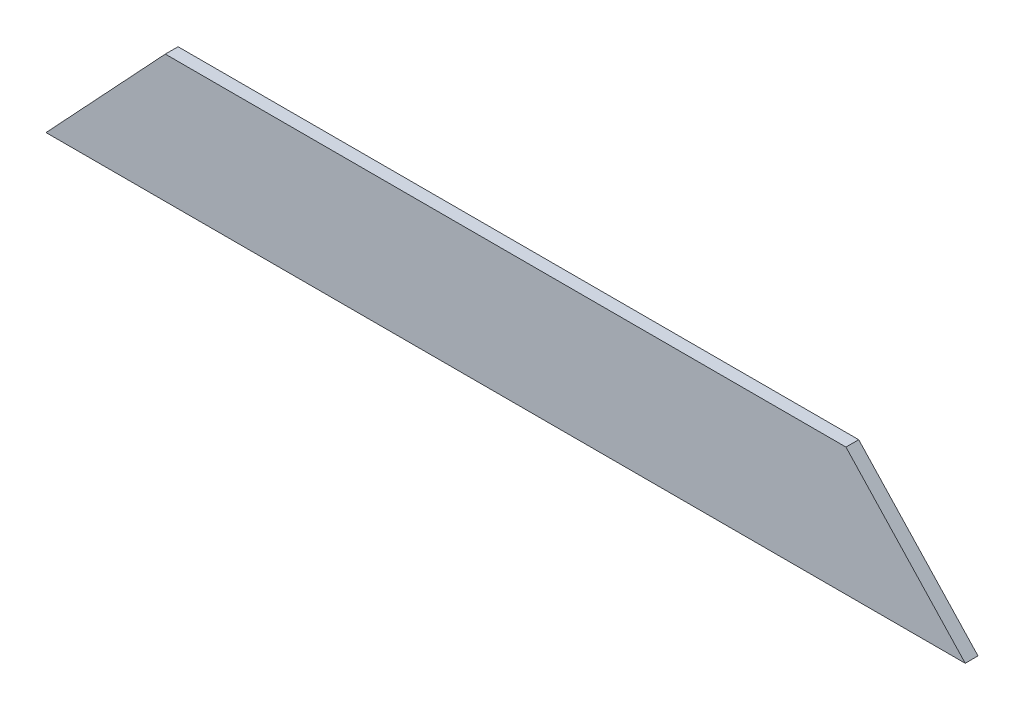
ISO-10303-21;
HEADER;
FILE_DESCRIPTION(('STEP AP214'),'2;1');
FILE_NAME('part.step','',(''),(''),'','','');
FILE_SCHEMA(('AUTOMOTIVE_DESIGN { 1 0 10303 214 1 1 1 1 }'));
ENDSEC;
DATA;
#1=APPLICATION_CONTEXT('core data for automotive mechanical design processes');
#2=APPLICATION_PROTOCOL_DEFINITION('international standard','automotive_design',2000,#1);
#3=PRODUCT_CONTEXT('',#1,'mechanical');
#4=PRODUCT('Part','Part','',(#3));
#5=PRODUCT_RELATED_PRODUCT_CATEGORY('part','',(#4));
#6=PRODUCT_DEFINITION_FORMATION('','',#4);
#7=PRODUCT_DEFINITION_CONTEXT('part definition',#1,'design');
#8=PRODUCT_DEFINITION('design','',#6,#7);
#9=PRODUCT_DEFINITION_SHAPE('','',#8);
#10=(LENGTH_UNIT() NAMED_UNIT(*) SI_UNIT(.MILLI.,.METRE.));
#11=(NAMED_UNIT(*) PLANE_ANGLE_UNIT() SI_UNIT($,.RADIAN.));
#12=(NAMED_UNIT(*) SI_UNIT($,.STERADIAN.) SOLID_ANGLE_UNIT());
#13=UNCERTAINTY_MEASURE_WITH_UNIT(LENGTH_MEASURE(1.E-05),#10,'distance_accuracy_value','');
#14=(GEOMETRIC_REPRESENTATION_CONTEXT(3) GLOBAL_UNCERTAINTY_ASSIGNED_CONTEXT((#13)) GLOBAL_UNIT_ASSIGNED_CONTEXT((#10,
#11,#12)) REPRESENTATION_CONTEXT('',''));
#15=CARTESIAN_POINT('',(0.,0.,0.));
#16=DIRECTION('',(0.,0.,1.));
#17=DIRECTION('',(1.,0.,0.));
#18=AXIS2_PLACEMENT_3D('',#15,#16,#17);
#19=CARTESIAN_POINT('',(28.9508659607808,44.9188924888224,2.));
#20=DIRECTION('',(0.730526939324922,-0.68288387806461,0.));
#21=DIRECTION('',(0.68288387806461,0.730526939324922,0.));
#22=AXIS2_PLACEMENT_3D('',#19,#20,#21);
#23=PLANE('',#22);
#24=DIRECTION('',(-0.68288387806461,-0.730526939324922,0.));
#25=VECTOR('',#24,1.);
#26=CARTESIAN_POINT('',(28.9508659607808,44.9188924888224,0.));
#27=LINE('',#26,#25);
#28=CARTESIAN_POINT('',(47.6465181346941,64.9188924888225,0.));
#29=VERTEX_POINT('',#28);
#30=CARTESIAN_POINT('',(28.9508659607808,44.9188924888224,0.));
#31=VERTEX_POINT('',#30);
#32=EDGE_CURVE('E95',#29,#31,#27,.T.);
#33=ORIENTED_EDGE('',*,*,#32,.T.);
#34=DIRECTION('',(0.,0.,-1.));
#35=VECTOR('',#34,1.);
#36=CARTESIAN_POINT('',(28.9508659607808,44.9188924888224,2.));
#37=LINE('',#36,#35);
#38=CARTESIAN_POINT('',(28.9508659607808,44.9188924888224,2.));
#39=VERTEX_POINT('',#38);
#40=EDGE_CURVE('E11',#39,#31,#37,.T.);
#41=ORIENTED_EDGE('',*,*,#40,.F.);
#42=DIRECTION('',(-0.68288387806461,-0.730526939324922,0.));
#43=VECTOR('',#42,1.);
#44=CARTESIAN_POINT('',(28.9508659607808,44.9188924888224,2.));
#45=LINE('',#44,#43);
#46=CARTESIAN_POINT('',(47.6465181346941,64.9188924888225,2.));
#47=VERTEX_POINT('',#46);
#48=EDGE_CURVE('E83',#47,#39,#45,.T.);
#49=ORIENTED_EDGE('',*,*,#48,.F.);
#50=DIRECTION('',(0.,0.,-1.));
#51=VECTOR('',#50,1.);
#52=CARTESIAN_POINT('',(47.6465181346941,64.9188924888225,2.));
#53=LINE('',#52,#51);
#54=EDGE_CURVE('E91',#47,#29,#53,.T.);
#55=ORIENTED_EDGE('',*,*,#54,.T.);
#56=EDGE_LOOP('',(#33,#41,#49,#55));
#57=FACE_BOUND('',#56,.T.);
#58=ADVANCED_FACE('F32',(#57),#23,.F.);
#59=CARTESIAN_POINT('',(173.010600499582,44.9188924888224,2.));
#60=DIRECTION('',(0.,1.,0.));
#61=DIRECTION('',(-1.,0.,0.));
#62=AXIS2_PLACEMENT_3D('',#59,#60,#61);
#63=PLANE('',#62);
#64=DIRECTION('',(1.,0.,0.));
#65=VECTOR('',#64,1.);
#66=CARTESIAN_POINT('',(173.010600499582,44.9188924888224,0.));
#67=LINE('',#66,#65);
#68=CARTESIAN_POINT('',(173.010600499582,44.9188924888224,0.));
#69=VERTEX_POINT('',#68);
#70=EDGE_CURVE('E87',#31,#69,#67,.T.);
#71=ORIENTED_EDGE('',*,*,#70,.T.);
#72=DIRECTION('',(0.,0.,-1.));
#73=VECTOR('',#72,1.);
#74=CARTESIAN_POINT('',(173.010600499582,44.9188924888224,2.));
#75=LINE('',#74,#73);
#76=CARTESIAN_POINT('',(173.010600499582,44.9188924888224,2.));
#77=VERTEX_POINT('',#76);
#78=EDGE_CURVE('E40',#77,#69,#75,.T.);
#79=ORIENTED_EDGE('',*,*,#78,.F.);
#80=DIRECTION('',(1.,0.,0.));
#81=VECTOR('',#80,1.);
#82=CARTESIAN_POINT('',(173.010600499582,44.9188924888224,2.));
#83=LINE('',#82,#81);
#84=EDGE_CURVE('E78',#39,#77,#83,.T.);
#85=ORIENTED_EDGE('',*,*,#84,.F.);
#86=ORIENTED_EDGE('',*,*,#40,.T.);
#87=EDGE_LOOP('',(#71,#79,#85,#86));
#88=FACE_BOUND('',#87,.T.);
#89=ADVANCED_FACE('F86',(#88),#63,.F.);
#90=CARTESIAN_POINT('',(154.314948325669,64.9188924888225,2.));
#91=DIRECTION('',(-0.730526939324931,-0.682883878064601,0.));
#92=DIRECTION('',(0.682883878064601,-0.730526939324931,0.));
#93=AXIS2_PLACEMENT_3D('',#90,#91,#92);
#94=PLANE('',#93);
#95=DIRECTION('',(-0.682883878064601,0.730526939324931,0.));
#96=VECTOR('',#95,1.);
#97=CARTESIAN_POINT('',(154.314948325669,64.9188924888225,0.));
#98=LINE('',#97,#96);
#99=CARTESIAN_POINT('',(154.314948325669,64.9188924888225,0.));
#100=VERTEX_POINT('',#99);
#101=EDGE_CURVE('E65',#69,#100,#98,.T.);
#102=ORIENTED_EDGE('',*,*,#101,.T.);
#103=DIRECTION('',(0.,0.,-1.));
#104=VECTOR('',#103,1.);
#105=CARTESIAN_POINT('',(154.314948325669,64.9188924888225,2.));
#106=LINE('',#105,#104);
#107=CARTESIAN_POINT('',(154.314948325669,64.9188924888225,2.));
#108=VERTEX_POINT('',#107);
#109=EDGE_CURVE('E88',#108,#100,#106,.T.);
#110=ORIENTED_EDGE('',*,*,#109,.F.);
#111=DIRECTION('',(-0.682883878064601,0.730526939324931,0.));
#112=VECTOR('',#111,1.);
#113=CARTESIAN_POINT('',(154.314948325669,64.9188924888225,2.));
#114=LINE('',#113,#112);
#115=EDGE_CURVE('E81',#77,#108,#114,.T.);
#116=ORIENTED_EDGE('',*,*,#115,.F.);
#117=ORIENTED_EDGE('',*,*,#78,.T.);
#118=EDGE_LOOP('',(#102,#110,#116,#117));
#119=FACE_BOUND('',#118,.T.);
#120=ADVANCED_FACE('F89',(#119),#94,.F.);
#121=CARTESIAN_POINT('',(47.6465181346941,64.9188924888225,2.));
#122=DIRECTION('',(0.,-1.,0.));
#123=DIRECTION('',(0.,0.,-1.));
#124=AXIS2_PLACEMENT_3D('',#121,#122,#123);
#125=PLANE('',#124);
#126=DIRECTION('',(-1.,0.,0.));
#127=VECTOR('',#126,1.);
#128=CARTESIAN_POINT('',(47.6465181346941,64.9188924888225,0.));
#129=LINE('',#128,#127);
#130=EDGE_CURVE('E71',#100,#29,#129,.T.);
#131=ORIENTED_EDGE('',*,*,#130,.T.);
#132=ORIENTED_EDGE('',*,*,#54,.F.);
#133=DIRECTION('',(-1.,0.,0.));
#134=VECTOR('',#133,1.);
#135=CARTESIAN_POINT('',(47.6465181346941,64.9188924888225,2.));
#136=LINE('',#135,#134);
#137=EDGE_CURVE('E48',#108,#47,#136,.T.);
#138=ORIENTED_EDGE('',*,*,#137,.F.);
#139=ORIENTED_EDGE('',*,*,#109,.T.);
#140=EDGE_LOOP('',(#131,#132,#138,#139));
#141=FACE_BOUND('',#140,.T.);
#142=ADVANCED_FACE('F102',(#141),#125,.F.);
#143=CARTESIAN_POINT('',(0.,0.,2.));
#144=DIRECTION('',(0.,0.,-1.));
#145=DIRECTION('',(-1.,0.,0.));
#146=AXIS2_PLACEMENT_3D('',#143,#144,#145);
#147=PLANE('',#146);
#148=ORIENTED_EDGE('',*,*,#48,.T.);
#149=ORIENTED_EDGE('',*,*,#84,.T.);
#150=ORIENTED_EDGE('',*,*,#115,.T.);
#151=ORIENTED_EDGE('',*,*,#137,.T.);
#152=EDGE_LOOP('',(#148,#149,#150,#151));
#153=FACE_BOUND('',#152,.T.);
#154=ADVANCED_FACE('F79',(#153),#147,.F.);
#155=CARTESIAN_POINT('',(0.,0.,0.));
#156=DIRECTION('',(0.,0.,-1.));
#157=DIRECTION('',(-1.,0.,0.));
#158=AXIS2_PLACEMENT_3D('',#155,#156,#157);
#159=PLANE('',#158);
#160=ORIENTED_EDGE('',*,*,#32,.F.);
#161=ORIENTED_EDGE('',*,*,#130,.F.);
#162=ORIENTED_EDGE('',*,*,#101,.F.);
#163=ORIENTED_EDGE('',*,*,#70,.F.);
#164=EDGE_LOOP('',(#160,#161,#162,#163));
#165=FACE_BOUND('',#164,.T.);
#166=ADVANCED_FACE('F105',(#165),#159,.T.);
#167=CLOSED_SHELL('',(#58,#89,#120,#142,#154,#166));
#168=MANIFOLD_SOLID_BREP('B2',#167);
#169=ADVANCED_BREP_SHAPE_REPRESENTATION('',(#18,#168),#14);
#170=SHAPE_DEFINITION_REPRESENTATION(#9,#169);
ENDSEC;
END-ISO-10303-21;
